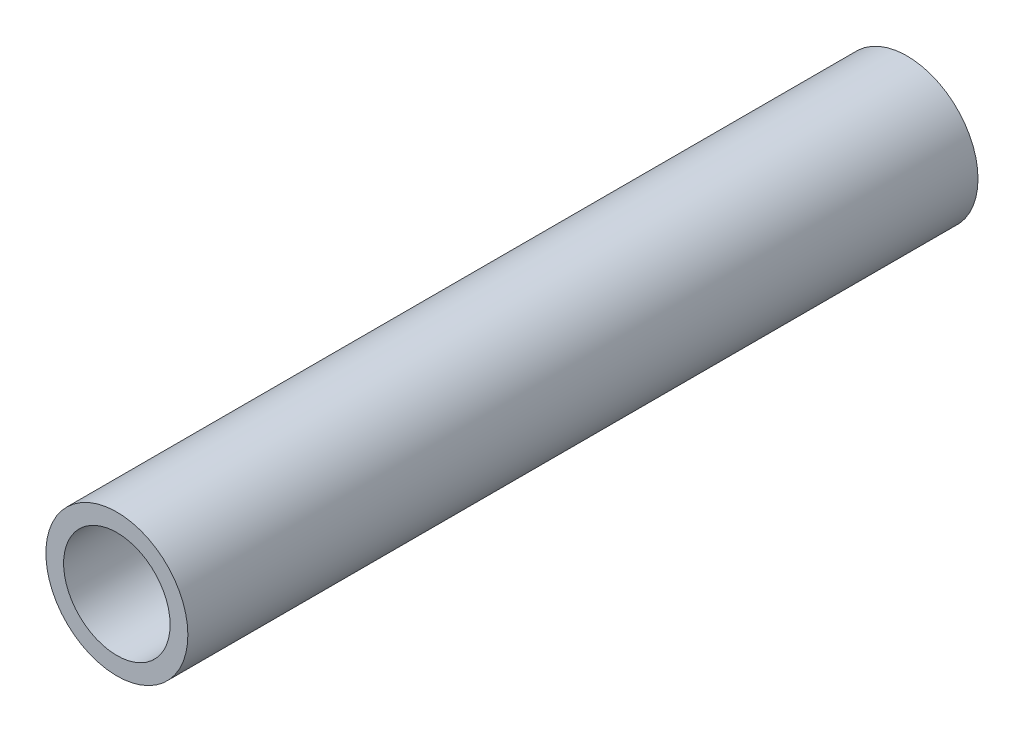
ISO-10303-21;
HEADER;
FILE_DESCRIPTION(('STEP AP214'),'2;1');
FILE_NAME('part.step','',(''),(''),'','','');
FILE_SCHEMA(('AUTOMOTIVE_DESIGN { 1 0 10303 214 1 1 1 1 }'));
ENDSEC;
DATA;
#1=APPLICATION_CONTEXT('core data for automotive mechanical design processes');
#2=APPLICATION_PROTOCOL_DEFINITION('international standard','automotive_design',2000,#1);
#3=PRODUCT_CONTEXT('',#1,'mechanical');
#4=PRODUCT('Part','Part','',(#3));
#5=PRODUCT_RELATED_PRODUCT_CATEGORY('part','',(#4));
#6=PRODUCT_DEFINITION_FORMATION('','',#4);
#7=PRODUCT_DEFINITION_CONTEXT('part definition',#1,'design');
#8=PRODUCT_DEFINITION('design','',#6,#7);
#9=PRODUCT_DEFINITION_SHAPE('','',#8);
#10=(LENGTH_UNIT() NAMED_UNIT(*) SI_UNIT(.MILLI.,.METRE.));
#11=(NAMED_UNIT(*) PLANE_ANGLE_UNIT() SI_UNIT($,.RADIAN.));
#12=(NAMED_UNIT(*) SI_UNIT($,.STERADIAN.) SOLID_ANGLE_UNIT());
#13=UNCERTAINTY_MEASURE_WITH_UNIT(LENGTH_MEASURE(1.E-05),#10,'distance_accuracy_value','');
#14=(GEOMETRIC_REPRESENTATION_CONTEXT(3) GLOBAL_UNCERTAINTY_ASSIGNED_CONTEXT((#13)) GLOBAL_UNIT_ASSIGNED_CONTEXT((#10,
#11,#12)) REPRESENTATION_CONTEXT('',''));
#15=CARTESIAN_POINT('',(0.,0.,0.));
#16=DIRECTION('',(0.,0.,1.));
#17=DIRECTION('',(1.,0.,0.));
#18=AXIS2_PLACEMENT_3D('',#15,#16,#17);
#19=CARTESIAN_POINT('',(0.,0.,222.57));
#20=DIRECTION('',(0.,0.,-1.));
#21=DIRECTION('',(-1.,0.,0.));
#22=AXIS2_PLACEMENT_3D('',#19,#20,#21);
#23=CYLINDRICAL_SURFACE('',#22,20.);
#24=CARTESIAN_POINT('',(0.,0.,222.57));
#25=DIRECTION('',(0.,0.,1.));
#26=DIRECTION('',(1.,0.,0.));
#27=AXIS2_PLACEMENT_3D('',#24,#25,#26);
#28=CIRCLE('',#27,20.);
#29=CARTESIAN_POINT('',(20.,0.,222.57));
#30=VERTEX_POINT('',#29);
#31=EDGE_CURVE('E10',#30,#30,#28,.T.);
#32=ORIENTED_EDGE('',*,*,#31,.F.);
#33=EDGE_LOOP('',(#32));
#34=FACE_BOUND('',#33,.T.);
#35=CARTESIAN_POINT('',(0.,0.,0.));
#36=DIRECTION('',(0.,0.,1.));
#37=DIRECTION('',(1.,0.,0.));
#38=AXIS2_PLACEMENT_3D('',#35,#36,#37);
#39=CIRCLE('',#38,20.);
#40=CARTESIAN_POINT('',(20.,0.,0.));
#41=VERTEX_POINT('',#40);
#42=EDGE_CURVE('E48',#41,#41,#39,.T.);
#43=ORIENTED_EDGE('',*,*,#42,.T.);
#44=EDGE_LOOP('',(#43));
#45=FACE_BOUND('',#44,.T.);
#46=ADVANCED_FACE('F45',(#34,#45),#23,.T.);
#47=CARTESIAN_POINT('',(0.,0.,222.57));
#48=DIRECTION('',(0.,0.,1.));
#49=DIRECTION('',(1.,0.,0.));
#50=AXIS2_PLACEMENT_3D('',#47,#48,#49);
#51=PLANE('',#50);
#52=CARTESIAN_POINT('',(0.,0.,222.57));
#53=DIRECTION('',(0.,0.,1.));
#54=DIRECTION('',(1.,0.,0.));
#55=AXIS2_PLACEMENT_3D('',#52,#53,#54);
#56=CIRCLE('',#55,15.);
#57=CARTESIAN_POINT('',(15.,0.,222.57));
#58=VERTEX_POINT('',#57);
#59=EDGE_CURVE('E59',#58,#58,#56,.T.);
#60=ORIENTED_EDGE('',*,*,#59,.F.);
#61=EDGE_LOOP('',(#60));
#62=FACE_BOUND('',#61,.T.);
#63=ORIENTED_EDGE('',*,*,#31,.T.);
#64=EDGE_LOOP('',(#63));
#65=FACE_BOUND('',#64,.T.);
#66=ADVANCED_FACE('F76',(#62,#65),#51,.T.);
#67=CARTESIAN_POINT('',(0.,0.,0.));
#68=DIRECTION('',(0.,0.,1.));
#69=DIRECTION('',(1.,0.,0.));
#70=AXIS2_PLACEMENT_3D('',#67,#68,#69);
#71=PLANE('',#70);
#72=CARTESIAN_POINT('',(0.,0.,0.));
#73=DIRECTION('',(0.,0.,1.));
#74=DIRECTION('',(1.,0.,0.));
#75=AXIS2_PLACEMENT_3D('',#72,#73,#74);
#76=CIRCLE('',#75,15.);
#77=CARTESIAN_POINT('',(15.,0.,0.));
#78=VERTEX_POINT('',#77);
#79=EDGE_CURVE('E57',#78,#78,#76,.T.);
#80=ORIENTED_EDGE('',*,*,#79,.T.);
#81=EDGE_LOOP('',(#80));
#82=FACE_BOUND('',#81,.T.);
#83=ORIENTED_EDGE('',*,*,#42,.F.);
#84=EDGE_LOOP('',(#83));
#85=FACE_BOUND('',#84,.T.);
#86=ADVANCED_FACE('F67',(#82,#85),#71,.F.);
#87=CARTESIAN_POINT('',(0.,0.,0.));
#88=DIRECTION('',(0.,0.,1.));
#89=DIRECTION('',(1.,0.,0.));
#90=AXIS2_PLACEMENT_3D('',#87,#88,#89);
#91=CYLINDRICAL_SURFACE('',#90,15.);
#92=ORIENTED_EDGE('',*,*,#79,.F.);
#93=EDGE_LOOP('',(#92));
#94=FACE_BOUND('',#93,.T.);
#95=ORIENTED_EDGE('',*,*,#59,.T.);
#96=EDGE_LOOP('',(#95));
#97=FACE_BOUND('',#96,.T.);
#98=ADVANCED_FACE('F70',(#94,#97),#91,.F.);
#99=CLOSED_SHELL('',(#46,#66,#86,#98));
#100=MANIFOLD_SOLID_BREP('B2',#99);
#101=ADVANCED_BREP_SHAPE_REPRESENTATION('',(#18,#100),#14);
#102=SHAPE_DEFINITION_REPRESENTATION(#9,#101);
ENDSEC;
END-ISO-10303-21;
